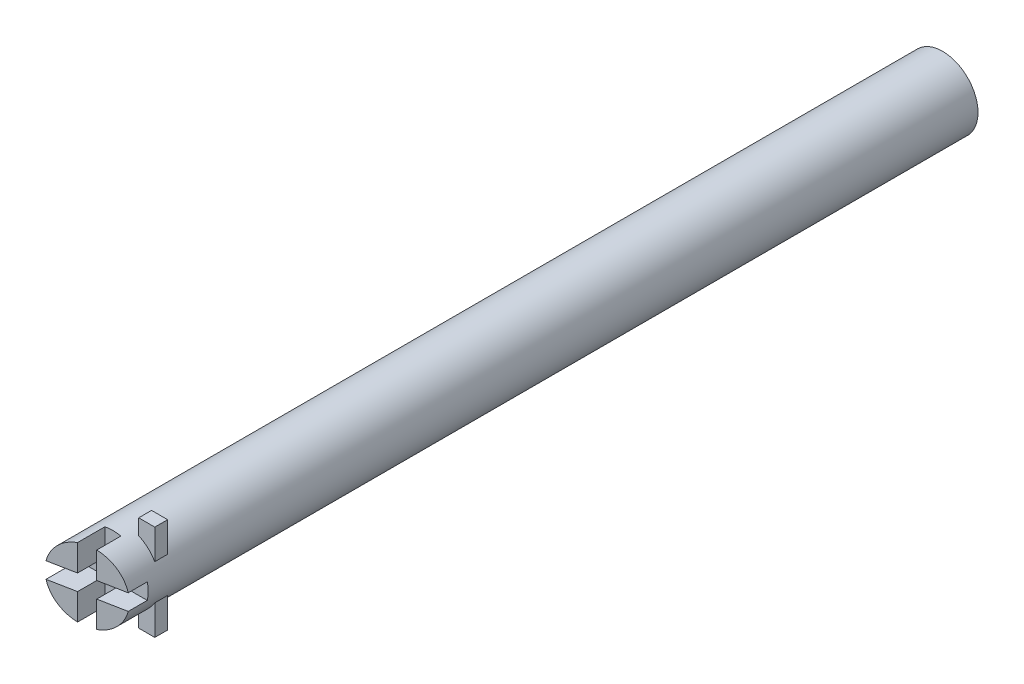
ISO-10303-21;
HEADER;
FILE_DESCRIPTION(('STEP AP214'),'2;1');
FILE_NAME('part.step','',(''),(''),'','','');
FILE_SCHEMA(('AUTOMOTIVE_DESIGN { 1 0 10303 214 1 1 1 1 }'));
ENDSEC;
DATA;
#1=APPLICATION_CONTEXT('core data for automotive mechanical design processes');
#2=APPLICATION_PROTOCOL_DEFINITION('international standard','automotive_design',2000,#1);
#3=PRODUCT_CONTEXT('',#1,'mechanical');
#4=PRODUCT('Part','Part','',(#3));
#5=PRODUCT_RELATED_PRODUCT_CATEGORY('part','',(#4));
#6=PRODUCT_DEFINITION_FORMATION('','',#4);
#7=PRODUCT_DEFINITION_CONTEXT('part definition',#1,'design');
#8=PRODUCT_DEFINITION('design','',#6,#7);
#9=PRODUCT_DEFINITION_SHAPE('','',#8);
#10=(LENGTH_UNIT() NAMED_UNIT(*) SI_UNIT(.MILLI.,.METRE.));
#11=(NAMED_UNIT(*) PLANE_ANGLE_UNIT() SI_UNIT($,.RADIAN.));
#12=(NAMED_UNIT(*) SI_UNIT($,.STERADIAN.) SOLID_ANGLE_UNIT());
#13=UNCERTAINTY_MEASURE_WITH_UNIT(LENGTH_MEASURE(1.E-05),#10,'distance_accuracy_value','');
#14=(GEOMETRIC_REPRESENTATION_CONTEXT(3) GLOBAL_UNCERTAINTY_ASSIGNED_CONTEXT((#13)) GLOBAL_UNIT_ASSIGNED_CONTEXT((#10,
#11,#12)) REPRESENTATION_CONTEXT('',''));
#15=CARTESIAN_POINT('',(0.,0.,0.));
#16=DIRECTION('',(0.,0.,1.));
#17=DIRECTION('',(1.,0.,0.));
#18=AXIS2_PLACEMENT_3D('',#15,#16,#17);
#19=CARTESIAN_POINT('',(-50.165,-5.552694,-5.08));
#20=DIRECTION('',(0.,0.,1.));
#21=DIRECTION('',(1.,0.,0.));
#22=AXIS2_PLACEMENT_3D('',#19,#20,#21);
#23=CYLINDRICAL_SURFACE('',#22,2.794);
#24=DIRECTION('',(0.,0.,1.));
#25=VECTOR('',#24,1.);
#26=CARTESIAN_POINT('',(-50.8,-8.27357823127482,-5.08));
#27=LINE('',#26,#25);
#28=CARTESIAN_POINT('',(-50.8,-8.27357823127482,62.6142783474156));
#29=VERTEX_POINT('',#28);
#30=CARTESIAN_POINT('',(-50.8,-8.27357823127482,60.4647595786594));
#31=VERTEX_POINT('',#30);
#32=EDGE_CURVE('E176',#29,#31,#27,.F.);
#33=ORIENTED_EDGE('',*,*,#32,.F.);
#34=CARTESIAN_POINT('',(-52.959,-5.552694,63.0353446457202));
#35=CARTESIAN_POINT('',(-52.9589927686939,-5.70745301027069,63.0353431300738));
#36=CARTESIAN_POINT('',(-52.9460945298133,-5.86232595786087,63.0327959421297));
#37=CARTESIAN_POINT('',(-52.8948642831939,-6.16776581303892,63.0226867694708));
#38=CARTESIAN_POINT('',(-52.8565014048968,-6.31832726245207,63.0151186979892));
#39=CARTESIAN_POINT('',(-52.7555752719999,-6.61063141505149,62.9952338899411));
#40=CARTESIAN_POINT('',(-52.6930335328517,-6.75238182889222,62.9829213752283));
#41=CARTESIAN_POINT('',(-52.5456867470066,-7.02325133068281,62.9539610911895));
#42=CARTESIAN_POINT('',(-52.4608864180122,-7.15237308732266,62.9373142405308));
#43=CARTESIAN_POINT('',(-52.2707266975709,-7.39562259948822,62.9000549753041));
#44=CARTESIAN_POINT('',(-52.1651976132095,-7.5096126163093,62.8794098505077));
#45=CARTESIAN_POINT('',(-51.9371275628662,-7.71831183198142,62.8348807502754));
#46=CARTESIAN_POINT('',(-51.8145845823591,-7.81301874434224,62.8109963913067));
#47=CARTESIAN_POINT('',(-51.5536419569731,-7.98224461484402,62.7602367865577));
#48=CARTESIAN_POINT('',(-51.4149995639565,-8.05637560071042,62.7333159960325));
#49=CARTESIAN_POINT('',(-51.1275864658163,-8.18030921996997,62.6776094345006));
#50=CARTESIAN_POINT('',(-50.9788148401904,-8.23010963893158,62.6488234940083));
#51=CARTESIAN_POINT('',(-50.6727850987664,-8.30474646399689,62.5897009715616));
#52=CARTESIAN_POINT('',(-50.5154286576949,-8.32916619607533,62.5593468427204));
#53=CARTESIAN_POINT('',(-50.1989027068357,-8.35098936882157,62.4983627736139));
#54=CARTESIAN_POINT('',(-50.0397330945066,-8.34839127388019,62.4677328177704));
#55=CARTESIAN_POINT('',(-49.7227737768342,-8.31610610526507,62.4067885863781));
#56=CARTESIAN_POINT('',(-49.5650049897246,-8.28620461356501,62.3764787333985));
#57=CARTESIAN_POINT('',(-49.2566566014226,-8.199765069151,62.3172665464218));
#58=CARTESIAN_POINT('',(-49.106077013156,-8.14322696854799,62.2883642149554));
#59=CARTESIAN_POINT('',(-48.8169973870813,-8.0052209627691,62.232884277419));
#60=CARTESIAN_POINT('',(-48.6784573243673,-7.9238400657627,62.2062989675809));
#61=CARTESIAN_POINT('',(-48.4170024695202,-7.73824560422668,62.1561196681617));
#62=CARTESIAN_POINT('',(-48.2940866797027,-7.63403349873721,62.1325254875832));
#63=CARTESIAN_POINT('',(-48.0691815805098,-7.40718832977368,62.0893412737202));
#64=CARTESIAN_POINT('',(-47.9669334727959,-7.28482136615936,62.0697017345654));
#65=CARTESIAN_POINT('',(-47.7845012116363,-7.0240777782817,62.0346486764975));
#66=CARTESIAN_POINT('',(-47.7043148105295,-6.88570278696866,62.0192347270793));
#67=CARTESIAN_POINT('',(-47.5697765529349,-6.59950447665823,61.9933652269065));
#68=CARTESIAN_POINT('',(-47.5149923748752,-6.45189185171185,61.9828267085782));
#69=CARTESIAN_POINT('',(-47.4309331242301,-6.14931892185258,61.9666538380667));
#70=CARTESIAN_POINT('',(-47.4016557170204,-5.9943592907774,61.9610190370483));
#71=CARTESIAN_POINT('',(-47.3697800189294,-5.68383945576485,61.9548840452478));
#72=CARTESIAN_POINT('',(-47.3668108330352,-5.52831863133818,61.954312472767));
#73=CARTESIAN_POINT('',(-47.3866732077747,-5.21899988229542,61.9581354469845));
#74=CARTESIAN_POINT('',(-47.409503760807,-5.06520189063149,61.96252979974));
#75=CARTESIAN_POINT('',(-47.4800952080766,-4.7643408940771,61.9761129866945));
#76=CARTESIAN_POINT('',(-47.5277525034154,-4.61725264325164,61.985281897196));
#77=CARTESIAN_POINT('',(-47.6464645864414,-4.33322315816838,62.0081122156504));
#78=CARTESIAN_POINT('',(-47.7175199591397,-4.19628217772285,62.0217737359299));
#79=CARTESIAN_POINT('',(-47.8815098354802,-3.9352755875146,62.0532900217188));
#80=CARTESIAN_POINT('',(-47.9746057340977,-3.81131517801245,62.071175716903));
#81=CARTESIAN_POINT('',(-48.179625409754,-3.58075914539161,62.1105496969745));
#82=CARTESIAN_POINT('',(-48.2915505796329,-3.47416480802619,62.132038248372));
#83=CARTESIAN_POINT('',(-48.5329154968455,-3.27955894626165,62.1783674582531));
#84=CARTESIAN_POINT('',(-48.6626030868101,-3.19186615508696,62.2032555345829));
#85=CARTESIAN_POINT('',(-48.9344026971718,-3.03945920515315,62.2554162758925));
#86=CARTESIAN_POINT('',(-49.0765158360042,-2.97474711756758,62.2826891555308));
#87=CARTESIAN_POINT('',(-49.371739230654,-2.86900739210467,62.3393628908404));
#88=CARTESIAN_POINT('',(-49.5249960872751,-2.82840412579107,62.3687921805687));
#89=CARTESIAN_POINT('',(-49.8359956054023,-2.77364244367394,62.4285523748143));
#90=CARTESIAN_POINT('',(-49.9937386077197,-2.75948604250978,62.4588833478402));
#91=CARTESIAN_POINT('',(-50.3111491744108,-2.75795809868624,62.5199789096775));
#92=CARTESIAN_POINT('',(-50.4708181209009,-2.77089467421297,62.5507444910012));
#93=CARTESIAN_POINT('',(-50.7857564623588,-2.82384875897709,62.6115126872909));
#94=CARTESIAN_POINT('',(-50.9410257388878,-2.86386699653092,62.6415152817151));
#95=CARTESIAN_POINT('',(-51.2428726470887,-2.97001222543384,62.6999380898874));
#96=CARTESIAN_POINT('',(-51.389441531035,-3.03616499866785,62.7283567093483));
#97=CARTESIAN_POINT('',(-51.6694178102229,-3.19284415055076,62.7827408955186));
#98=CARTESIAN_POINT('',(-51.8028262467166,-3.28336859880078,62.8087066562908));
#99=CARTESIAN_POINT('',(-52.0511644905703,-3.48528837125481,62.8571301195668));
#100=CARTESIAN_POINT('',(-52.1662716867143,-3.59645736797387,62.8796214294745));
#101=CARTESIAN_POINT('',(-52.3761526293712,-3.83725180910952,62.9206993505486));
#102=CARTESIAN_POINT('',(-52.470923136621,-3.96688018830643,62.9392853396591));
#103=CARTESIAN_POINT('',(-52.6356634640576,-4.2385127473525,62.971637638167));
#104=CARTESIAN_POINT('',(-52.7060278985358,-4.38026877158908,62.9854805867063));
#105=CARTESIAN_POINT('',(-52.8218555630584,-4.67383873613268,63.0082885502732));
#106=CARTESIAN_POINT('',(-52.8673524487703,-4.82563876921758,63.0172601580501));
#107=CARTESIAN_POINT('',(-52.9194051123128,-5.07420978219711,63.0275288784395));
#108=CARTESIAN_POINT('',(-52.9342327539174,-5.1692611709046,63.0304554241155));
#109=CARTESIAN_POINT('',(-52.9540323947995,-5.36042505163056,63.0343637688515));
#110=CARTESIAN_POINT('',(-52.9590044930298,-5.45653753298558,63.0353455874373));
#111=CARTESIAN_POINT('',(-52.959,-5.552694,63.0353446457202));
#112=B_SPLINE_CURVE_WITH_KNOTS('',3,(#34,#35,#36,#37,#38,#39,#40,#41,#42,#43,#44,#45,#46,#47,
#48,#49,#50,#51,#52,#53,#54,#55,#56,#57,#58,#59,#60,#61,#62,#63,#64,#65,#66,#67,#68,#69,#70,#71,
#72,#73,#74,#75,#76,#77,#78,#79,#80,#81,#82,#83,#84,#85,#86,#87,#88,#89,#90,#91,#92,#93,#94,#95,
#96,#97,#98,#99,#100,#101,#102,#103,#104,#105,#106,#107,#108,#109,#110,#111),.UNSPECIFIED.,.T.,
.F.,(4,2,2,2,2,2,2,2,2,2,2,2,2,2,2,2,2,2,2,2,2,2,2,2,2,2,2,2,2,2,2,2,2,2,2,2,2,2,4),(0.,
0.463922376801987,0.928408192280444,1.39248163494778,1.85645679667968,2.32440166666044,
2.79240199083745,3.26870529624374,3.74505194402954,4.229100842439,4.7131772528314,
5.20108819776948,5.68900001990987,6.17522223750674,6.66141339188078,7.1410770568508,
7.62069183526022,8.0918138503175,8.56289273923822,9.02731957412607,9.49172827158696,
9.95421439137503,10.4167120753628,10.8827073492734,11.3487371089864,11.8220985924368,
12.2955027275453,12.7770102077684,13.258554366228,13.7456046668205,14.2326680663447,
14.7202131616558,15.2077196515057,15.6901672320832,16.1726916008047,16.6470043048342,
17.1206734758285,17.4089254137326,17.6971744574825),.UNSPECIFIED.);
#113=CARTESIAN_POINT('',(-52.8858842312748,-6.18769399999999,63.0209163095032));
#114=VERTEX_POINT('',#113);
#115=EDGE_CURVE('E279',#114,#29,#112,.T.);
#116=ORIENTED_EDGE('',*,*,#115,.F.);
#117=DIRECTION('',(0.,0.,1.));
#118=VECTOR('',#117,1.);
#119=CARTESIAN_POINT('',(-52.8858842312748,-6.187694,-5.08));
#120=LINE('',#119,#118);
#121=CARTESIAN_POINT('',(-52.8858842312748,-6.187694,60.4647595786594));
#122=VERTEX_POINT('',#121);
#123=EDGE_CURVE('E233',#122,#114,#120,.T.);
#124=ORIENTED_EDGE('',*,*,#123,.F.);
#125=CARTESIAN_POINT('',(-50.165,-5.552694,60.4647595786594));
#126=DIRECTION('',(0.,0.,1.));
#127=DIRECTION('',(1.,0.,0.));
#128=AXIS2_PLACEMENT_3D('',#125,#126,#127);
#129=CIRCLE('',#128,2.794);
#130=CARTESIAN_POINT('',(-52.8858842312748,-4.917694,60.4647595786594));
#131=VERTEX_POINT('',#130);
#132=EDGE_CURVE('E41',#122,#131,#129,.F.);
#133=ORIENTED_EDGE('',*,*,#132,.T.);
#134=DIRECTION('',(0.,0.,1.));
#135=VECTOR('',#134,1.);
#136=CARTESIAN_POINT('',(-52.8858842312748,-4.917694,-5.08));
#137=LINE('',#136,#135);
#138=CARTESIAN_POINT('',(-52.8858842312748,-4.917694,63.0209163095032));
#139=VERTEX_POINT('',#138);
#140=EDGE_CURVE('E188',#131,#139,#137,.T.);
#141=ORIENTED_EDGE('',*,*,#140,.T.);
#142=CARTESIAN_POINT('',(-50.8,-2.83180976872518,62.6142783474156));
#143=VERTEX_POINT('',#142);
#144=EDGE_CURVE('E270',#143,#139,#112,.T.);
#145=ORIENTED_EDGE('',*,*,#144,.F.);
#146=DIRECTION('',(0.,0.,1.));
#147=VECTOR('',#146,1.);
#148=CARTESIAN_POINT('',(-50.8,-2.83180976872518,-5.08));
#149=LINE('',#148,#147);
#150=CARTESIAN_POINT('',(-50.8,-2.83180976872518,60.4647595786594));
#151=VERTEX_POINT('',#150);
#152=EDGE_CURVE('E218',#151,#143,#149,.T.);
#153=ORIENTED_EDGE('',*,*,#152,.F.);
#154=CARTESIAN_POINT('',(-49.53,-2.83180976872518,60.4647595786594));
#155=VERTEX_POINT('',#154);
#156=EDGE_CURVE('E375',#151,#155,#129,.F.);
#157=ORIENTED_EDGE('',*,*,#156,.T.);
#158=DIRECTION('',(0.,0.,1.));
#159=VECTOR('',#158,1.);
#160=CARTESIAN_POINT('',(-49.53,-2.83180976872518,-5.08));
#161=LINE('',#160,#159);
#162=CARTESIAN_POINT('',(-49.53,-2.83180976872518,62.3697595786594));
#163=VERTEX_POINT('',#162);
#164=EDGE_CURVE('E220',#155,#163,#161,.T.);
#165=ORIENTED_EDGE('',*,*,#164,.T.);
#166=CARTESIAN_POINT('',(-47.4441157687252,-4.917694,61.9691898322809));
#167=VERTEX_POINT('',#166);
#168=EDGE_CURVE('E278',#167,#163,#112,.T.);
#169=ORIENTED_EDGE('',*,*,#168,.F.);
#170=DIRECTION('',(0.,0.,1.));
#171=VECTOR('',#170,1.);
#172=CARTESIAN_POINT('',(-47.4441157687252,-4.917694,-5.08));
#173=LINE('',#172,#171);
#174=CARTESIAN_POINT('',(-47.4441157687252,-4.917694,60.4647595786594));
#175=VERTEX_POINT('',#174);
#176=EDGE_CURVE('E223',#167,#175,#173,.F.);
#177=ORIENTED_EDGE('',*,*,#176,.T.);
#178=CARTESIAN_POINT('',(-47.4441157687252,-6.187694,60.4647595786594));
#179=VERTEX_POINT('',#178);
#180=EDGE_CURVE('E36',#175,#179,#129,.F.);
#181=ORIENTED_EDGE('',*,*,#180,.T.);
#182=DIRECTION('',(0.,0.,1.));
#183=VECTOR('',#182,1.);
#184=CARTESIAN_POINT('',(-47.4441157687252,-6.187694,-5.08));
#185=LINE('',#184,#183);
#186=CARTESIAN_POINT('',(-47.4441157687252,-6.18769399999999,61.9691898322809));
#187=VERTEX_POINT('',#186);
#188=EDGE_CURVE('E226',#187,#179,#185,.F.);
#189=ORIENTED_EDGE('',*,*,#188,.F.);
#190=CARTESIAN_POINT('',(-49.53,-8.27357823127482,62.3697595786594));
#191=VERTEX_POINT('',#190);
#192=EDGE_CURVE('E328',#191,#187,#112,.T.);
#193=ORIENTED_EDGE('',*,*,#192,.F.);
#194=DIRECTION('',(0.,0.,1.));
#195=VECTOR('',#194,1.);
#196=CARTESIAN_POINT('',(-49.53,-8.27357823127482,-5.08));
#197=LINE('',#196,#195);
#198=CARTESIAN_POINT('',(-49.53,-8.27357823127482,60.4647595786594));
#199=VERTEX_POINT('',#198);
#200=EDGE_CURVE('E229',#191,#199,#197,.F.);
#201=ORIENTED_EDGE('',*,*,#200,.T.);
#202=EDGE_CURVE('E11',#199,#31,#129,.F.);
#203=ORIENTED_EDGE('',*,*,#202,.T.);
#204=EDGE_LOOP('',(#33,#116,#124,#133,#141,#145,#153,#157,#165,#169,#177,#181,#189,#193,#201,#203));
#205=FACE_BOUND('',#204,.T.);
#206=CARTESIAN_POINT('',(-50.165,-5.552694,59.563));
#207=DIRECTION('',(0.,0.,1.));
#208=DIRECTION('',(1.,0.,0.));
#209=AXIS2_PLACEMENT_3D('',#206,#207,#208);
#210=CIRCLE('',#209,2.794);
#211=CARTESIAN_POINT('',(-47.7519999982804,-6.96119213336792,59.563));
#212=VERTEX_POINT('',#211);
#213=CARTESIAN_POINT('',(-49.0219999982804,-8.1022012065144,59.563));
#214=VERTEX_POINT('',#213);
#215=EDGE_CURVE('E315',#212,#214,#210,.F.);
#216=ORIENTED_EDGE('',*,*,#215,.F.);
#217=DIRECTION('',(0.,0.,1.));
#218=VECTOR('',#217,1.);
#219=CARTESIAN_POINT('',(-47.7519999982804,-6.96119213336792,-5.08));
#220=LINE('',#219,#218);
#221=CARTESIAN_POINT('',(-47.7519999982804,-6.96119213336792,58.547));
#222=VERTEX_POINT('',#221);
#223=EDGE_CURVE('E336',#212,#222,#220,.F.);
#224=ORIENTED_EDGE('',*,*,#223,.T.);
#225=CARTESIAN_POINT('',(-50.165,-5.552694,58.547));
#226=DIRECTION('',(0.,0.,1.));
#227=DIRECTION('',(1.,0.,0.));
#228=AXIS2_PLACEMENT_3D('',#225,#226,#227);
#229=CIRCLE('',#228,2.794);
#230=CARTESIAN_POINT('',(-49.0219999982804,-8.1022012065144,58.547));
#231=VERTEX_POINT('',#230);
#232=EDGE_CURVE('E327',#222,#231,#229,.F.);
#233=ORIENTED_EDGE('',*,*,#232,.T.);
#234=DIRECTION('',(0.,0.,1.));
#235=VECTOR('',#234,1.);
#236=CARTESIAN_POINT('',(-49.0219999982804,-8.1022012065144,-5.08));
#237=LINE('',#236,#235);
#238=EDGE_CURVE('E334',#231,#214,#237,.T.);
#239=ORIENTED_EDGE('',*,*,#238,.T.);
#240=EDGE_LOOP('',(#216,#224,#233,#239));
#241=FACE_BOUND('',#240,.T.);
#242=CARTESIAN_POINT('',(-49.0219999982804,-3.0031867934856,59.563));
#243=VERTEX_POINT('',#242);
#244=CARTESIAN_POINT('',(-47.7519999982804,-4.14419586663208,59.563));
#245=VERTEX_POINT('',#244);
#246=EDGE_CURVE('E320',#243,#245,#210,.F.);
#247=ORIENTED_EDGE('',*,*,#246,.F.);
#248=DIRECTION('',(0.,0.,1.));
#249=VECTOR('',#248,1.);
#250=CARTESIAN_POINT('',(-49.0219999982804,-3.0031867934856,-5.08));
#251=LINE('',#250,#249);
#252=CARTESIAN_POINT('',(-49.0219999982804,-3.0031867934856,58.547));
#253=VERTEX_POINT('',#252);
#254=EDGE_CURVE('E325',#243,#253,#251,.F.);
#255=ORIENTED_EDGE('',*,*,#254,.T.);
#256=CARTESIAN_POINT('',(-47.7519999982804,-4.14419586663208,58.547));
#257=VERTEX_POINT('',#256);
#258=EDGE_CURVE('E323',#253,#257,#229,.F.);
#259=ORIENTED_EDGE('',*,*,#258,.T.);
#260=DIRECTION('',(0.,0.,1.));
#261=VECTOR('',#260,1.);
#262=CARTESIAN_POINT('',(-47.7519999982804,-4.14419586663208,-5.08));
#263=LINE('',#262,#261);
#264=EDGE_CURVE('E331',#257,#245,#263,.T.);
#265=ORIENTED_EDGE('',*,*,#264,.T.);
#266=EDGE_LOOP('',(#247,#255,#259,#265));
#267=FACE_BOUND('',#266,.T.);
#268=CARTESIAN_POINT('',(-50.165,-5.552694,-5.08));
#269=DIRECTION('',(0.,0.,1.));
#270=DIRECTION('',(1.,0.,0.));
#271=AXIS2_PLACEMENT_3D('',#268,#269,#270);
#272=CIRCLE('',#271,2.794);
#273=CARTESIAN_POINT('',(-47.371,-5.552694,-5.08));
#274=VERTEX_POINT('',#273);
#275=EDGE_CURVE('E322',#274,#274,#272,.T.);
#276=ORIENTED_EDGE('',*,*,#275,.T.);
#277=EDGE_LOOP('',(#276));
#278=FACE_BOUND('',#277,.T.);
#279=ADVANCED_FACE('F33',(#205,#241,#267,#278),#23,.T.);
#280=CARTESIAN_POINT('',(0.,90.4757127410445,29.2734999999999));
#281=CARTESIAN_POINT('',(-3.54445229127338,90.4757127410445,56.3261267561434));
#282=CARTESIAN_POINT('',(-34.2353893219788,90.4757127410445,59.1066137188246));
#283=CARTESIAN_POINT('',(-55.88,90.4757127410445,63.627));
#284=B_SPLINE_CURVE_WITH_KNOTS('',3,(#280,#281,#282,#283),.UNSPECIFIED.,.F.,.F.,(4,4),(0.,1.),.UNSPECIFIED.);
#285=DIRECTION('',(0.,-1.,0.));
#286=VECTOR('',#285,1.);
#287=SURFACE_OF_LINEAR_EXTRUSION('',#284,#286);
#288=CARTESIAN_POINT('',(0.,-6.18769400000001,29.2734999999999));
#289=CARTESIAN_POINT('',(-3.54445229127338,-6.18769400000001,56.3261267561434));
#290=CARTESIAN_POINT('',(-34.2353893219788,-6.18769399999999,59.1066137188246));
#291=CARTESIAN_POINT('',(-55.88,-6.18769399999999,63.627));
#292=B_SPLINE_CURVE_WITH_KNOTS('',3,(#288,#289,#290,#291),.UNSPECIFIED.,.F.,.F.,(4,4),(0.,1.),.UNSPECIFIED.);
#293=CARTESIAN_POINT('',(-49.53,-6.187694,62.3697595783291));
#294=VERTEX_POINT('',#293);
#295=EDGE_CURVE('E356',#294,#187,#292,.F.);
#296=ORIENTED_EDGE('',*,*,#295,.F.);
#297=DIRECTION('',(0.,-1.,0.));
#298=VECTOR('',#297,1.);
#299=CARTESIAN_POINT('',(-49.53,-5.56075717756833,62.3697595786594));
#300=LINE('',#299,#298);
#301=EDGE_CURVE('E363',#294,#191,#300,.T.);
#302=ORIENTED_EDGE('',*,*,#301,.T.);
#303=ORIENTED_EDGE('',*,*,#192,.T.);
#304=EDGE_LOOP('',(#296,#302,#303));
#305=FACE_BOUND('',#304,.T.);
#306=ADVANCED_FACE('F292',(#305),#287,.T.);
#307=DIRECTION('',(0.,-1.,0.));
#308=VECTOR('',#307,1.);
#309=CARTESIAN_POINT('',(-49.53,-5.56075717756833,62.3697595786594));
#310=LINE('',#309,#308);
#311=CARTESIAN_POINT('',(-49.53,-4.917694,62.3697595786594));
#312=VERTEX_POINT('',#311);
#313=EDGE_CURVE('E348',#163,#312,#310,.T.);
#314=ORIENTED_EDGE('',*,*,#313,.T.);
#315=CARTESIAN_POINT('',(0.,-4.91769400000001,29.2734999999999));
#316=CARTESIAN_POINT('',(-3.54445229127338,-4.91769400000001,56.3261267561434));
#317=CARTESIAN_POINT('',(-34.2353893219788,-4.917694,59.1066137188246));
#318=CARTESIAN_POINT('',(-55.88,-4.917694,63.627));
#319=B_SPLINE_CURVE_WITH_KNOTS('',3,(#315,#316,#317,#318),.UNSPECIFIED.,.F.,.F.,(4,4),(0.,1.),.UNSPECIFIED.);
#320=EDGE_CURVE('E351',#312,#167,#319,.F.);
#321=ORIENTED_EDGE('',*,*,#320,.T.);
#322=ORIENTED_EDGE('',*,*,#168,.T.);
#323=EDGE_LOOP('',(#314,#321,#322));
#324=FACE_BOUND('',#323,.T.);
#325=ADVANCED_FACE('F299',(#324),#287,.T.);
#326=CARTESIAN_POINT('',(0.,-6.18769400000001,29.2734999999999));
#327=CARTESIAN_POINT('',(-3.54445229127338,-6.18769400000001,56.3261267561434));
#328=CARTESIAN_POINT('',(-34.2353893219788,-6.18769399999999,59.1066137188246));
#329=CARTESIAN_POINT('',(-55.88,-6.18769399999999,63.627));
#330=B_SPLINE_CURVE_WITH_KNOTS('',3,(#326,#327,#328,#329),.UNSPECIFIED.,.F.,.F.,(4,4),(0.,1.),.UNSPECIFIED.);
#331=CARTESIAN_POINT('',(-50.8,-6.187694,62.6142783474156));
#332=VERTEX_POINT('',#331);
#333=EDGE_CURVE('E187',#114,#332,#330,.F.);
#334=ORIENTED_EDGE('',*,*,#333,.F.);
#335=ORIENTED_EDGE('',*,*,#115,.T.);
#336=DIRECTION('',(0.,-1.,0.));
#337=VECTOR('',#336,1.);
#338=CARTESIAN_POINT('',(-50.8,-5.56075717756833,62.6142783474156));
#339=LINE('',#338,#337);
#340=EDGE_CURVE('E369',#332,#29,#339,.T.);
#341=ORIENTED_EDGE('',*,*,#340,.F.);
#342=EDGE_LOOP('',(#334,#335,#341));
#343=FACE_BOUND('',#342,.T.);
#344=ADVANCED_FACE('F293',(#343),#287,.T.);
#345=CARTESIAN_POINT('',(-50.165,-5.552694,-5.08));
#346=DIRECTION('',(0.,0.,1.));
#347=DIRECTION('',(1.,0.,0.));
#348=AXIS2_PLACEMENT_3D('',#345,#346,#347);
#349=PLANE('',#348);
#350=ORIENTED_EDGE('',*,*,#275,.F.);
#351=EDGE_LOOP('',(#350));
#352=FACE_BOUND('',#351,.T.);
#353=ADVANCED_FACE('F290',(#352),#349,.F.);
#354=DIRECTION('',(0.,-1.,0.));
#355=VECTOR('',#354,1.);
#356=CARTESIAN_POINT('',(-50.8,-5.56075717756833,62.6142783474156));
#357=LINE('',#356,#355);
#358=CARTESIAN_POINT('',(-50.8000000047959,-4.917694,62.6142783483419));
#359=VERTEX_POINT('',#358);
#360=EDGE_CURVE('E343',#143,#359,#357,.T.);
#361=ORIENTED_EDGE('',*,*,#360,.F.);
#362=ORIENTED_EDGE('',*,*,#144,.T.);
#363=CARTESIAN_POINT('',(0.,-4.91769400000001,29.2734999999999));
#364=CARTESIAN_POINT('',(-3.54445229127338,-4.91769400000001,56.3261267561434));
#365=CARTESIAN_POINT('',(-34.2353893219788,-4.917694,59.1066137188246));
#366=CARTESIAN_POINT('',(-55.88,-4.917694,63.627));
#367=B_SPLINE_CURVE_WITH_KNOTS('',3,(#363,#364,#365,#366),.UNSPECIFIED.,.F.,.F.,(4,4),(0.,1.),.UNSPECIFIED.);
#368=EDGE_CURVE('E338',#139,#359,#367,.F.);
#369=ORIENTED_EDGE('',*,*,#368,.T.);
#370=EDGE_LOOP('',(#361,#362,#369));
#371=FACE_BOUND('',#370,.T.);
#372=ADVANCED_FACE('F286',(#371),#287,.T.);
#373=CARTESIAN_POINT('',(-47.7519999982804,-1.77799999999999,59.563));
#374=DIRECTION('',(0.,-1.,0.));
#375=DIRECTION('',(1.,0.,0.));
#376=AXIS2_PLACEMENT_3D('',#373,#374,#375);
#377=PLANE('',#376);
#378=DIRECTION('',(-1.,0.,0.));
#379=VECTOR('',#378,1.);
#380=CARTESIAN_POINT('',(-47.7519999982804,-1.77799999999999,58.547));
#381=LINE('',#380,#379);
#382=CARTESIAN_POINT('',(-47.7519999982804,-1.77799999999999,58.547));
#383=VERTEX_POINT('',#382);
#384=CARTESIAN_POINT('',(-49.0219999982804,-1.77799999999999,58.547));
#385=VERTEX_POINT('',#384);
#386=EDGE_CURVE('E252',#383,#385,#381,.T.);
#387=ORIENTED_EDGE('',*,*,#386,.T.);
#388=DIRECTION('',(0.,0.,-1.));
#389=VECTOR('',#388,1.);
#390=CARTESIAN_POINT('',(-49.0219999982804,-1.77799999999999,59.563));
#391=LINE('',#390,#389);
#392=CARTESIAN_POINT('',(-49.0219999982804,-1.77799999999999,59.563));
#393=VERTEX_POINT('',#392);
#394=EDGE_CURVE('E264',#393,#385,#391,.T.);
#395=ORIENTED_EDGE('',*,*,#394,.F.);
#396=DIRECTION('',(-1.,0.,0.));
#397=VECTOR('',#396,1.);
#398=CARTESIAN_POINT('',(-47.7519999982804,-1.77799999999999,59.563));
#399=LINE('',#398,#397);
#400=CARTESIAN_POINT('',(-47.7519999982804,-1.77799999999999,59.563));
#401=VERTEX_POINT('',#400);
#402=EDGE_CURVE('E239',#401,#393,#399,.T.);
#403=ORIENTED_EDGE('',*,*,#402,.F.);
#404=DIRECTION('',(0.,0.,-1.));
#405=VECTOR('',#404,1.);
#406=CARTESIAN_POINT('',(-47.7519999982804,-1.77799999999999,59.563));
#407=LINE('',#406,#405);
#408=EDGE_CURVE('E267',#401,#383,#407,.T.);
#409=ORIENTED_EDGE('',*,*,#408,.T.);
#410=EDGE_LOOP('',(#387,#395,#403,#409));
#411=FACE_BOUND('',#410,.T.);
#412=ADVANCED_FACE('F289',(#411),#377,.F.);
#413=CARTESIAN_POINT('',(0.,0.,58.547));
#414=DIRECTION('',(0.,0.,1.));
#415=DIRECTION('',(1.,0.,0.));
#416=AXIS2_PLACEMENT_3D('',#413,#414,#415);
#417=PLANE('',#416);
#418=ORIENTED_EDGE('',*,*,#258,.F.);
#419=DIRECTION('',(0.,-1.,0.));
#420=VECTOR('',#419,1.);
#421=CARTESIAN_POINT('',(-49.0219999982804,-9.32741068508388,58.547));
#422=LINE('',#421,#420);
#423=EDGE_CURVE('E254',#385,#253,#422,.T.);
#424=ORIENTED_EDGE('',*,*,#423,.F.);
#425=ORIENTED_EDGE('',*,*,#386,.F.);
#426=DIRECTION('',(0.,1.,0.));
#427=VECTOR('',#426,1.);
#428=CARTESIAN_POINT('',(-47.7519999982804,-9.32741068508388,58.547));
#429=LINE('',#428,#427);
#430=EDGE_CURVE('E235',#257,#383,#429,.T.);
#431=ORIENTED_EDGE('',*,*,#430,.F.);
#432=EDGE_LOOP('',(#418,#424,#425,#431));
#433=FACE_BOUND('',#432,.T.);
#434=ADVANCED_FACE('F419',(#433),#417,.F.);
#435=CARTESIAN_POINT('',(0.,0.,59.563));
#436=DIRECTION('',(0.,0.,1.));
#437=DIRECTION('',(1.,0.,0.));
#438=AXIS2_PLACEMENT_3D('',#435,#436,#437);
#439=PLANE('',#438);
#440=DIRECTION('',(0.,-1.,0.));
#441=VECTOR('',#440,1.);
#442=CARTESIAN_POINT('',(-49.0219999982804,-9.32741068508388,59.563));
#443=LINE('',#442,#441);
#444=EDGE_CURVE('E243',#393,#243,#443,.T.);
#445=ORIENTED_EDGE('',*,*,#444,.T.);
#446=ORIENTED_EDGE('',*,*,#246,.T.);
#447=DIRECTION('',(0.,1.,0.));
#448=VECTOR('',#447,1.);
#449=CARTESIAN_POINT('',(-47.7519999982804,-9.32741068508388,59.563));
#450=LINE('',#449,#448);
#451=EDGE_CURVE('E240',#245,#401,#450,.T.);
#452=ORIENTED_EDGE('',*,*,#451,.T.);
#453=ORIENTED_EDGE('',*,*,#402,.T.);
#454=EDGE_LOOP('',(#445,#446,#452,#453));
#455=FACE_BOUND('',#454,.T.);
#456=ADVANCED_FACE('F415',(#455),#439,.T.);
#457=CARTESIAN_POINT('',(-49.0219999982804,-9.32741068508388,59.563));
#458=DIRECTION('',(1.,0.,0.));
#459=DIRECTION('',(0.,0.,-1.));
#460=AXIS2_PLACEMENT_3D('',#457,#458,#459);
#461=PLANE('',#460);
#462=ORIENTED_EDGE('',*,*,#254,.F.);
#463=ORIENTED_EDGE('',*,*,#444,.F.);
#464=ORIENTED_EDGE('',*,*,#394,.T.);
#465=ORIENTED_EDGE('',*,*,#423,.T.);
#466=EDGE_LOOP('',(#462,#463,#464,#465));
#467=FACE_BOUND('',#466,.T.);
#468=ADVANCED_FACE('F418',(#467),#461,.F.);
#469=CARTESIAN_POINT('',(-47.7519999982804,-9.32741068508388,59.563));
#470=DIRECTION('',(-1.,0.,0.));
#471=DIRECTION('',(0.,0.,1.));
#472=AXIS2_PLACEMENT_3D('',#469,#470,#471);
#473=PLANE('',#472);
#474=ORIENTED_EDGE('',*,*,#264,.F.);
#475=ORIENTED_EDGE('',*,*,#430,.T.);
#476=ORIENTED_EDGE('',*,*,#408,.F.);
#477=ORIENTED_EDGE('',*,*,#451,.F.);
#478=EDGE_LOOP('',(#474,#475,#476,#477));
#479=FACE_BOUND('',#478,.T.);
#480=ADVANCED_FACE('F435',(#479),#473,.F.);
#481=ORIENTED_EDGE('',*,*,#223,.F.);
#482=CARTESIAN_POINT('',(-47.7519999982804,-9.32741068508388,59.563));
#483=VERTEX_POINT('',#482);
#484=EDGE_CURVE('E236',#483,#212,#450,.T.);
#485=ORIENTED_EDGE('',*,*,#484,.F.);
#486=DIRECTION('',(0.,0.,-1.));
#487=VECTOR('',#486,1.);
#488=CARTESIAN_POINT('',(-47.7519999982804,-9.32741068508388,59.563));
#489=LINE('',#488,#487);
#490=CARTESIAN_POINT('',(-47.7519999982804,-9.32741068508388,58.547));
#491=VERTEX_POINT('',#490);
#492=EDGE_CURVE('E248',#483,#491,#489,.T.);
#493=ORIENTED_EDGE('',*,*,#492,.T.);
#494=EDGE_CURVE('E249',#491,#222,#429,.T.);
#495=ORIENTED_EDGE('',*,*,#494,.T.);
#496=EDGE_LOOP('',(#481,#485,#493,#495));
#497=FACE_BOUND('',#496,.T.);
#498=ADVANCED_FACE('F437',(#497),#473,.F.);
#499=ORIENTED_EDGE('',*,*,#484,.T.);
#500=ORIENTED_EDGE('',*,*,#215,.T.);
#501=CARTESIAN_POINT('',(-49.0219999982804,-9.32741068508388,59.563));
#502=VERTEX_POINT('',#501);
#503=EDGE_CURVE('E242',#214,#502,#443,.T.);
#504=ORIENTED_EDGE('',*,*,#503,.T.);
#505=DIRECTION('',(1.,0.,0.));
#506=VECTOR('',#505,1.);
#507=CARTESIAN_POINT('',(-47.7519999982804,-9.32741068508388,59.563));
#508=LINE('',#507,#506);
#509=EDGE_CURVE('E246',#502,#483,#508,.T.);
#510=ORIENTED_EDGE('',*,*,#509,.T.);
#511=EDGE_LOOP('',(#499,#500,#504,#510));
#512=FACE_BOUND('',#511,.T.);
#513=ADVANCED_FACE('F421',(#512),#439,.T.);
#514=ORIENTED_EDGE('',*,*,#232,.F.);
#515=ORIENTED_EDGE('',*,*,#494,.F.);
#516=DIRECTION('',(1.,0.,0.));
#517=VECTOR('',#516,1.);
#518=CARTESIAN_POINT('',(-47.7519999982804,-9.32741068508388,58.547));
#519=LINE('',#518,#517);
#520=CARTESIAN_POINT('',(-49.0219999982804,-9.32741068508388,58.547));
#521=VERTEX_POINT('',#520);
#522=EDGE_CURVE('E257',#521,#491,#519,.T.);
#523=ORIENTED_EDGE('',*,*,#522,.F.);
#524=EDGE_CURVE('E56',#231,#521,#422,.T.);
#525=ORIENTED_EDGE('',*,*,#524,.F.);
#526=EDGE_LOOP('',(#514,#515,#523,#525));
#527=FACE_BOUND('',#526,.T.);
#528=ADVANCED_FACE('F425',(#527),#417,.F.);
#529=ORIENTED_EDGE('',*,*,#238,.F.);
#530=ORIENTED_EDGE('',*,*,#524,.T.);
#531=DIRECTION('',(0.,0.,-1.));
#532=VECTOR('',#531,1.);
#533=CARTESIAN_POINT('',(-49.0219999982804,-9.32741068508388,59.563));
#534=LINE('',#533,#532);
#535=EDGE_CURVE('E261',#502,#521,#534,.T.);
#536=ORIENTED_EDGE('',*,*,#535,.F.);
#537=ORIENTED_EDGE('',*,*,#503,.F.);
#538=EDGE_LOOP('',(#529,#530,#536,#537));
#539=FACE_BOUND('',#538,.T.);
#540=ADVANCED_FACE('F428',(#539),#461,.F.);
#541=CARTESIAN_POINT('',(-47.7519999982804,-9.32741068508388,59.563));
#542=DIRECTION('',(0.,1.,0.));
#543=DIRECTION('',(0.,0.,1.));
#544=AXIS2_PLACEMENT_3D('',#541,#542,#543);
#545=PLANE('',#544);
#546=ORIENTED_EDGE('',*,*,#522,.T.);
#547=ORIENTED_EDGE('',*,*,#492,.F.);
#548=ORIENTED_EDGE('',*,*,#509,.F.);
#549=ORIENTED_EDGE('',*,*,#535,.T.);
#550=EDGE_LOOP('',(#546,#547,#548,#549));
#551=FACE_BOUND('',#550,.T.);
#552=ADVANCED_FACE('F414',(#551),#545,.F.);
#553=CARTESIAN_POINT('',(0.,-6.187694,63.2007939494261));
#554=DIRECTION('',(0.,-1.,0.));
#555=DIRECTION('',(0.,0.,-1.));
#556=AXIS2_PLACEMENT_3D('',#553,#554,#555);
#557=PLANE('',#556);
#558=ORIENTED_EDGE('',*,*,#123,.T.);
#559=ORIENTED_EDGE('',*,*,#333,.T.);
#560=DIRECTION('',(0.,0.,-1.));
#561=VECTOR('',#560,1.);
#562=CARTESIAN_POINT('',(-50.8,-6.187694,63.2007939494261));
#563=LINE('',#562,#561);
#564=CARTESIAN_POINT('',(-50.8,-6.187694,60.4647595786594));
#565=VERTEX_POINT('',#564);
#566=EDGE_CURVE('E173',#332,#565,#563,.T.);
#567=ORIENTED_EDGE('',*,*,#566,.T.);
#568=DIRECTION('',(-1.,0.,0.));
#569=VECTOR('',#568,1.);
#570=CARTESIAN_POINT('',(0.,-6.187694,60.4647595786594));
#571=LINE('',#570,#569);
#572=EDGE_CURVE('E180',#565,#122,#571,.T.);
#573=ORIENTED_EDGE('',*,*,#572,.T.);
#574=EDGE_LOOP('',(#558,#559,#567,#573));
#575=FACE_BOUND('',#574,.T.);
#576=ADVANCED_FACE('F184',(#575),#557,.F.);
#577=CARTESIAN_POINT('',(-50.8,0.,63.2007939494261));
#578=DIRECTION('',(-1.,0.,0.));
#579=DIRECTION('',(0.,0.,1.));
#580=AXIS2_PLACEMENT_3D('',#577,#578,#579);
#581=PLANE('',#580);
#582=ORIENTED_EDGE('',*,*,#32,.T.);
#583=DIRECTION('',(0.,1.,0.));
#584=VECTOR('',#583,1.);
#585=CARTESIAN_POINT('',(-50.8,0.,60.4647595786594));
#586=LINE('',#585,#584);
#587=EDGE_CURVE('E170',#31,#565,#586,.T.);
#588=ORIENTED_EDGE('',*,*,#587,.T.);
#589=ORIENTED_EDGE('',*,*,#566,.F.);
#590=ORIENTED_EDGE('',*,*,#340,.T.);
#591=EDGE_LOOP('',(#582,#588,#589,#590));
#592=FACE_BOUND('',#591,.T.);
#593=ADVANCED_FACE('F172',(#592),#581,.F.);
#594=CARTESIAN_POINT('',(-49.53,0.,63.2007939494261));
#595=DIRECTION('',(-1.,0.,0.));
#596=DIRECTION('',(0.,0.,1.));
#597=AXIS2_PLACEMENT_3D('',#594,#595,#596);
#598=PLANE('',#597);
#599=ORIENTED_EDGE('',*,*,#301,.F.);
#600=DIRECTION('',(0.,0.,-1.));
#601=VECTOR('',#600,1.);
#602=CARTESIAN_POINT('',(-49.53,-6.187694,63.2007939494261));
#603=LINE('',#602,#601);
#604=CARTESIAN_POINT('',(-49.53,-6.187694,60.4647595786594));
#605=VERTEX_POINT('',#604);
#606=EDGE_CURVE('E189',#294,#605,#603,.T.);
#607=ORIENTED_EDGE('',*,*,#606,.T.);
#608=DIRECTION('',(0.,1.,0.));
#609=VECTOR('',#608,1.);
#610=CARTESIAN_POINT('',(-49.53,0.,60.4647595786594));
#611=LINE('',#610,#609);
#612=EDGE_CURVE('E179',#199,#605,#611,.T.);
#613=ORIENTED_EDGE('',*,*,#612,.F.);
#614=ORIENTED_EDGE('',*,*,#200,.F.);
#615=EDGE_LOOP('',(#599,#607,#613,#614));
#616=FACE_BOUND('',#615,.T.);
#617=ADVANCED_FACE('F405',(#616),#598,.T.);
#618=CARTESIAN_POINT('',(0.,-6.187694,63.2007939494261));
#619=DIRECTION('',(0.,-1.,0.));
#620=DIRECTION('',(0.,0.,-1.));
#621=AXIS2_PLACEMENT_3D('',#618,#619,#620);
#622=PLANE('',#621);
#623=ORIENTED_EDGE('',*,*,#188,.T.);
#624=DIRECTION('',(-1.,0.,0.));
#625=VECTOR('',#624,1.);
#626=CARTESIAN_POINT('',(0.,-6.187694,60.4647595786594));
#627=LINE('',#626,#625);
#628=EDGE_CURVE('E197',#179,#605,#627,.T.);
#629=ORIENTED_EDGE('',*,*,#628,.T.);
#630=ORIENTED_EDGE('',*,*,#606,.F.);
#631=ORIENTED_EDGE('',*,*,#295,.T.);
#632=EDGE_LOOP('',(#623,#629,#630,#631));
#633=FACE_BOUND('',#632,.T.);
#634=ADVANCED_FACE('F401',(#633),#622,.F.);
#635=CARTESIAN_POINT('',(0.,-4.917694,63.2007939494261));
#636=DIRECTION('',(0.,-1.,0.));
#637=DIRECTION('',(0.,0.,-1.));
#638=AXIS2_PLACEMENT_3D('',#635,#636,#637);
#639=PLANE('',#638);
#640=ORIENTED_EDGE('',*,*,#320,.F.);
#641=DIRECTION('',(0.,0.,-1.));
#642=VECTOR('',#641,1.);
#643=CARTESIAN_POINT('',(-49.53,-4.917694,63.2007939494261));
#644=LINE('',#643,#642);
#645=CARTESIAN_POINT('',(-49.53,-4.917694,60.4647595786594));
#646=VERTEX_POINT('',#645);
#647=EDGE_CURVE('E211',#312,#646,#644,.T.);
#648=ORIENTED_EDGE('',*,*,#647,.T.);
#649=DIRECTION('',(-1.,0.,0.));
#650=VECTOR('',#649,1.);
#651=CARTESIAN_POINT('',(0.,-4.917694,60.4647595786594));
#652=LINE('',#651,#650);
#653=EDGE_CURVE('E200',#175,#646,#652,.T.);
#654=ORIENTED_EDGE('',*,*,#653,.F.);
#655=ORIENTED_EDGE('',*,*,#176,.F.);
#656=EDGE_LOOP('',(#640,#648,#654,#655));
#657=FACE_BOUND('',#656,.T.);
#658=ADVANCED_FACE('F397',(#657),#639,.T.);
#659=CARTESIAN_POINT('',(-49.53,0.,63.2007939494261));
#660=DIRECTION('',(-1.,0.,0.));
#661=DIRECTION('',(0.,0.,1.));
#662=AXIS2_PLACEMENT_3D('',#659,#660,#661);
#663=PLANE('',#662);
#664=DIRECTION('',(0.,1.,0.));
#665=VECTOR('',#664,1.);
#666=CARTESIAN_POINT('',(-49.53,0.,60.4647595786594));
#667=LINE('',#666,#665);
#668=EDGE_CURVE('E202',#646,#155,#667,.T.);
#669=ORIENTED_EDGE('',*,*,#668,.F.);
#670=ORIENTED_EDGE('',*,*,#647,.F.);
#671=ORIENTED_EDGE('',*,*,#313,.F.);
#672=ORIENTED_EDGE('',*,*,#164,.F.);
#673=EDGE_LOOP('',(#669,#670,#671,#672));
#674=FACE_BOUND('',#673,.T.);
#675=ADVANCED_FACE('F392',(#674),#663,.T.);
#676=CARTESIAN_POINT('',(-50.8,0.,63.2007939494261));
#677=DIRECTION('',(-1.,0.,0.));
#678=DIRECTION('',(0.,0.,1.));
#679=AXIS2_PLACEMENT_3D('',#676,#677,#678);
#680=PLANE('',#679);
#681=ORIENTED_EDGE('',*,*,#152,.T.);
#682=ORIENTED_EDGE('',*,*,#360,.T.);
#683=DIRECTION('',(0.,0.,-1.));
#684=VECTOR('',#683,1.);
#685=CARTESIAN_POINT('',(-50.8,-4.917694,63.2007939494261));
#686=LINE('',#685,#684);
#687=CARTESIAN_POINT('',(-50.8,-4.917694,60.4647595786594));
#688=VERTEX_POINT('',#687);
#689=EDGE_CURVE('E48',#359,#688,#686,.T.);
#690=ORIENTED_EDGE('',*,*,#689,.T.);
#691=DIRECTION('',(0.,1.,0.));
#692=VECTOR('',#691,1.);
#693=CARTESIAN_POINT('',(-50.8,0.,60.4647595786594));
#694=LINE('',#693,#692);
#695=EDGE_CURVE('E205',#688,#151,#694,.T.);
#696=ORIENTED_EDGE('',*,*,#695,.T.);
#697=EDGE_LOOP('',(#681,#682,#690,#696));
#698=FACE_BOUND('',#697,.T.);
#699=ADVANCED_FACE('F382',(#698),#680,.F.);
#700=CARTESIAN_POINT('',(0.,-4.917694,63.2007939494261));
#701=DIRECTION('',(0.,-1.,0.));
#702=DIRECTION('',(0.,0.,-1.));
#703=AXIS2_PLACEMENT_3D('',#700,#701,#702);
#704=PLANE('',#703);
#705=DIRECTION('',(-1.,0.,0.));
#706=VECTOR('',#705,1.);
#707=CARTESIAN_POINT('',(0.,-4.917694,60.4647595786594));
#708=LINE('',#707,#706);
#709=EDGE_CURVE('E208',#688,#131,#708,.T.);
#710=ORIENTED_EDGE('',*,*,#709,.F.);
#711=ORIENTED_EDGE('',*,*,#689,.F.);
#712=ORIENTED_EDGE('',*,*,#368,.F.);
#713=ORIENTED_EDGE('',*,*,#140,.F.);
#714=EDGE_LOOP('',(#710,#711,#712,#713));
#715=FACE_BOUND('',#714,.T.);
#716=ADVANCED_FACE('F384',(#715),#704,.T.);
#717=CARTESIAN_POINT('',(0.,0.,60.4647595786594));
#718=DIRECTION('',(0.,0.,1.));
#719=DIRECTION('',(1.,0.,0.));
#720=AXIS2_PLACEMENT_3D('',#717,#718,#719);
#721=PLANE('',#720);
#722=ORIENTED_EDGE('',*,*,#612,.T.);
#723=ORIENTED_EDGE('',*,*,#628,.F.);
#724=ORIENTED_EDGE('',*,*,#180,.F.);
#725=ORIENTED_EDGE('',*,*,#653,.T.);
#726=ORIENTED_EDGE('',*,*,#668,.T.);
#727=ORIENTED_EDGE('',*,*,#156,.F.);
#728=ORIENTED_EDGE('',*,*,#695,.F.);
#729=ORIENTED_EDGE('',*,*,#709,.T.);
#730=ORIENTED_EDGE('',*,*,#132,.F.);
#731=ORIENTED_EDGE('',*,*,#572,.F.);
#732=ORIENTED_EDGE('',*,*,#587,.F.);
#733=ORIENTED_EDGE('',*,*,#202,.F.);
#734=EDGE_LOOP('',(#722,#723,#724,#725,#726,#727,#728,#729,#730,#731,#732,#733));
#735=FACE_BOUND('',#734,.T.);
#736=ADVANCED_FACE('F191',(#735),#721,.T.);
#737=CLOSED_SHELL('',(#279,#306,#325,#344,#353,#372,#412,#434,#456,#468,#480,#498,#513,#528,
#540,#552,#576,#593,#617,#634,#658,#675,#699,#716,#736));
#738=MANIFOLD_SOLID_BREP('B2',#737);
#739=ADVANCED_BREP_SHAPE_REPRESENTATION('',(#18,#738),#14);
#740=SHAPE_DEFINITION_REPRESENTATION(#9,#739);
ENDSEC;
END-ISO-10303-21;
